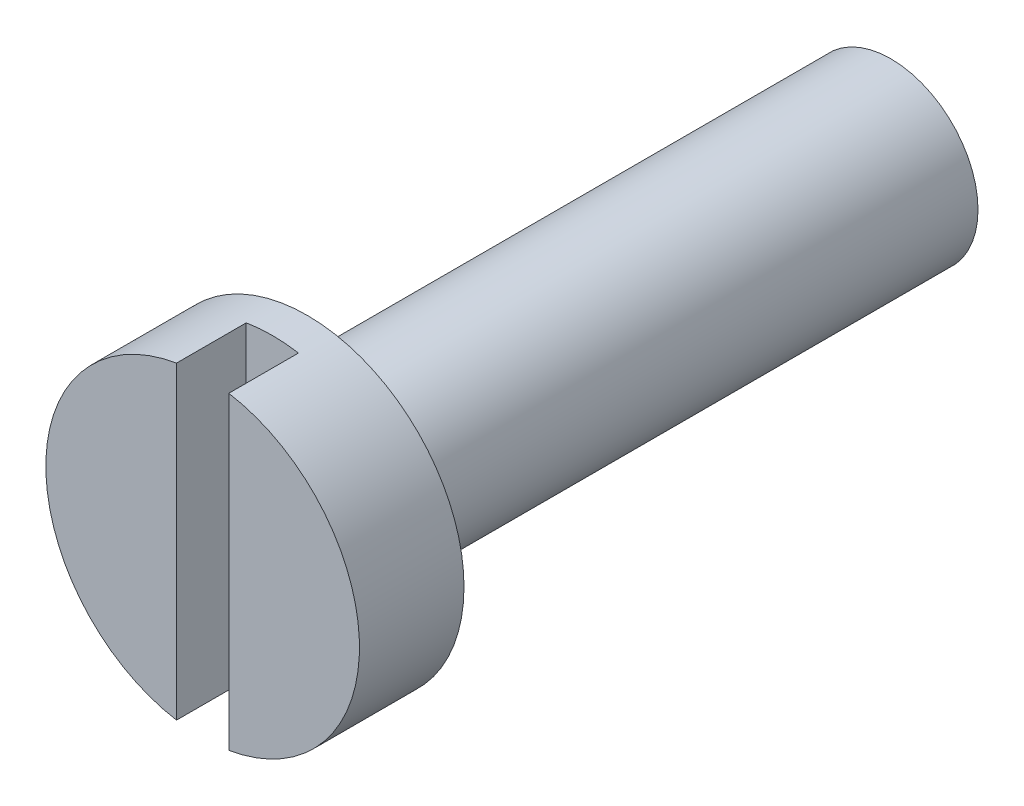
ISO-10303-21;
HEADER;
FILE_DESCRIPTION(('STEP AP214'),'2;1');
FILE_NAME('part.step','',(''),(''),'','','');
FILE_SCHEMA(('AUTOMOTIVE_DESIGN { 1 0 10303 214 1 1 1 1 }'));
ENDSEC;
DATA;
#1=APPLICATION_CONTEXT('core data for automotive mechanical design processes');
#2=APPLICATION_PROTOCOL_DEFINITION('international standard','automotive_design',2000,#1);
#3=PRODUCT_CONTEXT('',#1,'mechanical');
#4=PRODUCT('Part','Part','',(#3));
#5=PRODUCT_RELATED_PRODUCT_CATEGORY('part','',(#4));
#6=PRODUCT_DEFINITION_FORMATION('','',#4);
#7=PRODUCT_DEFINITION_CONTEXT('part definition',#1,'design');
#8=PRODUCT_DEFINITION('design','',#6,#7);
#9=PRODUCT_DEFINITION_SHAPE('','',#8);
#10=(LENGTH_UNIT() NAMED_UNIT(*) SI_UNIT(.MILLI.,.METRE.));
#11=(NAMED_UNIT(*) PLANE_ANGLE_UNIT() SI_UNIT($,.RADIAN.));
#12=(NAMED_UNIT(*) SI_UNIT($,.STERADIAN.) SOLID_ANGLE_UNIT());
#13=UNCERTAINTY_MEASURE_WITH_UNIT(LENGTH_MEASURE(1.E-05),#10,'distance_accuracy_value','');
#14=(GEOMETRIC_REPRESENTATION_CONTEXT(3) GLOBAL_UNCERTAINTY_ASSIGNED_CONTEXT((#13)) GLOBAL_UNIT_ASSIGNED_CONTEXT((#10,
#11,#12)) REPRESENTATION_CONTEXT('',''));
#15=CARTESIAN_POINT('',(0.,0.,0.));
#16=DIRECTION('',(0.,0.,1.));
#17=DIRECTION('',(1.,0.,0.));
#18=AXIS2_PLACEMENT_3D('',#15,#16,#17);
#19=CARTESIAN_POINT('',(0.,0.,19.75));
#20=DIRECTION('',(0.,0.,1.));
#21=DIRECTION('',(1.,0.,0.));
#22=AXIS2_PLACEMENT_3D('',#19,#20,#21);
#23=PLANE('',#22);
#24=DIRECTION('',(0.,1.,0.));
#25=VECTOR('',#24,1.);
#26=CARTESIAN_POINT('',(0.75,0.,19.75));
#27=LINE('',#26,#25);
#28=CARTESIAN_POINT('',(0.750000000000001,-4.43705983732471,19.75));
#29=VERTEX_POINT('',#28);
#30=CARTESIAN_POINT('',(0.75,4.43705983732471,19.75));
#31=VERTEX_POINT('',#30);
#32=EDGE_CURVE('E122',#29,#31,#27,.T.);
#33=ORIENTED_EDGE('',*,*,#32,.F.);
#34=CARTESIAN_POINT('',(0.,0.,19.75));
#35=DIRECTION('',(0.,0.,1.));
#36=DIRECTION('',(1.,0.,0.));
#37=AXIS2_PLACEMENT_3D('',#34,#35,#36);
#38=CIRCLE('',#37,4.5);
#39=EDGE_CURVE('E109',#29,#31,#38,.T.);
#40=ORIENTED_EDGE('',*,*,#39,.T.);
#41=EDGE_LOOP('',(#33,#40));
#42=FACE_BOUND('',#41,.T.);
#43=ADVANCED_FACE('F37',(#42),#23,.T.);
#44=CARTESIAN_POINT('',(0.,0.,16.75));
#45=DIRECTION('',(0.,0.,-1.));
#46=DIRECTION('',(-1.,0.,0.));
#47=AXIS2_PLACEMENT_3D('',#44,#45,#46);
#48=CYLINDRICAL_SURFACE('',#47,2.5);
#49=CARTESIAN_POINT('',(0.,0.,16.75));
#50=DIRECTION('',(0.,0.,1.));
#51=DIRECTION('',(1.,0.,0.));
#52=AXIS2_PLACEMENT_3D('',#49,#50,#51);
#53=CIRCLE('',#52,2.5);
#54=CARTESIAN_POINT('',(2.5,0.,16.75));
#55=VERTEX_POINT('',#54);
#56=EDGE_CURVE('E115',#55,#55,#53,.T.);
#57=ORIENTED_EDGE('',*,*,#56,.F.);
#58=EDGE_LOOP('',(#57));
#59=FACE_BOUND('',#58,.T.);
#60=CARTESIAN_POINT('',(0.,0.,0.));
#61=DIRECTION('',(0.,0.,1.));
#62=DIRECTION('',(1.,0.,0.));
#63=AXIS2_PLACEMENT_3D('',#60,#61,#62);
#64=CIRCLE('',#63,2.5);
#65=CARTESIAN_POINT('',(2.5,0.,0.));
#66=VERTEX_POINT('',#65);
#67=EDGE_CURVE('E119',#66,#66,#64,.T.);
#68=ORIENTED_EDGE('',*,*,#67,.T.);
#69=EDGE_LOOP('',(#68));
#70=FACE_BOUND('',#69,.T.);
#71=ADVANCED_FACE('F39',(#59,#70),#48,.T.);
#72=CARTESIAN_POINT('',(0.,0.,0.));
#73=DIRECTION('',(0.,0.,1.));
#74=DIRECTION('',(1.,0.,0.));
#75=AXIS2_PLACEMENT_3D('',#72,#73,#74);
#76=PLANE('',#75);
#77=CARTESIAN_POINT('',(0.,0.,0.));
#78=DIRECTION('',(0.,0.,-1.));
#79=DIRECTION('',(-1.,0.,0.));
#80=AXIS2_PLACEMENT_3D('',#77,#78,#79);
#81=CIRCLE('',#80,1.25);
#82=CARTESIAN_POINT('',(-1.25,0.,0.));
#83=VERTEX_POINT('',#82);
#84=EDGE_CURVE('E91',#83,#83,#81,.T.);
#85=ORIENTED_EDGE('',*,*,#84,.F.);
#86=EDGE_LOOP('',(#85));
#87=FACE_BOUND('',#86,.T.);
#88=ORIENTED_EDGE('',*,*,#67,.F.);
#89=EDGE_LOOP('',(#88));
#90=FACE_BOUND('',#89,.T.);
#91=ADVANCED_FACE('F140',(#87,#90),#76,.F.);
#92=CARTESIAN_POINT('',(0.,0.,19.75));
#93=DIRECTION('',(0.,0.,-1.));
#94=DIRECTION('',(-1.,0.,0.));
#95=AXIS2_PLACEMENT_3D('',#92,#93,#94);
#96=CYLINDRICAL_SURFACE('',#95,4.5);
#97=CARTESIAN_POINT('',(0.,0.,17.75));
#98=DIRECTION('',(0.,0.,1.));
#99=DIRECTION('',(1.,0.,0.));
#100=AXIS2_PLACEMENT_3D('',#97,#98,#99);
#101=CIRCLE('',#100,4.5);
#102=CARTESIAN_POINT('',(0.75,4.43705983732471,17.75));
#103=VERTEX_POINT('',#102);
#104=CARTESIAN_POINT('',(-0.75,4.43705983732471,17.75));
#105=VERTEX_POINT('',#104);
#106=EDGE_CURVE('E11',#103,#105,#101,.T.);
#107=ORIENTED_EDGE('',*,*,#106,.F.);
#108=DIRECTION('',(0.,0.,-1.));
#109=VECTOR('',#108,1.);
#110=CARTESIAN_POINT('',(0.75,4.43705983732471,19.75));
#111=LINE('',#110,#109);
#112=EDGE_CURVE('E60',#103,#31,#111,.F.);
#113=ORIENTED_EDGE('',*,*,#112,.T.);
#114=ORIENTED_EDGE('',*,*,#39,.F.);
#115=DIRECTION('',(0.,0.,-1.));
#116=VECTOR('',#115,1.);
#117=CARTESIAN_POINT('',(0.750000000000001,-4.43705983732471,19.75));
#118=LINE('',#117,#116);
#119=CARTESIAN_POINT('',(0.750000000000001,-4.43705983732471,17.75));
#120=VERTEX_POINT('',#119);
#121=EDGE_CURVE('E105',#29,#120,#118,.T.);
#122=ORIENTED_EDGE('',*,*,#121,.T.);
#123=CARTESIAN_POINT('',(-0.749999999999999,-4.43705983732471,17.75));
#124=VERTEX_POINT('',#123);
#125=EDGE_CURVE('E41',#124,#120,#101,.T.);
#126=ORIENTED_EDGE('',*,*,#125,.F.);
#127=DIRECTION('',(0.,0.,-1.));
#128=VECTOR('',#127,1.);
#129=CARTESIAN_POINT('',(-0.749999999999999,-4.43705983732471,19.75));
#130=LINE('',#129,#128);
#131=CARTESIAN_POINT('',(-0.749999999999999,-4.43705983732471,19.75));
#132=VERTEX_POINT('',#131);
#133=EDGE_CURVE('E100',#124,#132,#130,.F.);
#134=ORIENTED_EDGE('',*,*,#133,.T.);
#135=CARTESIAN_POINT('',(-0.75,4.43705983732471,19.75));
#136=VERTEX_POINT('',#135);
#137=EDGE_CURVE('E112',#136,#132,#38,.T.);
#138=ORIENTED_EDGE('',*,*,#137,.F.);
#139=DIRECTION('',(0.,0.,-1.));
#140=VECTOR('',#139,1.);
#141=CARTESIAN_POINT('',(-0.75,4.43705983732471,19.75));
#142=LINE('',#141,#140);
#143=EDGE_CURVE('E52',#136,#105,#142,.T.);
#144=ORIENTED_EDGE('',*,*,#143,.T.);
#145=EDGE_LOOP('',(#107,#113,#114,#122,#126,#134,#138,#144));
#146=FACE_BOUND('',#145,.T.);
#147=CARTESIAN_POINT('',(0.,0.,16.75));
#148=DIRECTION('',(0.,0.,1.));
#149=DIRECTION('',(1.,0.,0.));
#150=AXIS2_PLACEMENT_3D('',#147,#148,#149);
#151=CIRCLE('',#150,4.5);
#152=CARTESIAN_POINT('',(4.5,0.,16.75));
#153=VERTEX_POINT('',#152);
#154=EDGE_CURVE('E108',#153,#153,#151,.T.);
#155=ORIENTED_EDGE('',*,*,#154,.T.);
#156=EDGE_LOOP('',(#155));
#157=FACE_BOUND('',#156,.T.);
#158=ADVANCED_FACE('F131',(#146,#157),#96,.T.);
#159=DIRECTION('',(0.,-1.,0.));
#160=VECTOR('',#159,1.);
#161=CARTESIAN_POINT('',(-0.75,0.,19.75));
#162=LINE('',#161,#160);
#163=EDGE_CURVE('E118',#136,#132,#162,.T.);
#164=ORIENTED_EDGE('',*,*,#163,.F.);
#165=ORIENTED_EDGE('',*,*,#137,.T.);
#166=EDGE_LOOP('',(#164,#165));
#167=FACE_BOUND('',#166,.T.);
#168=ADVANCED_FACE('F136',(#167),#23,.T.);
#169=CARTESIAN_POINT('',(0.,0.,16.75));
#170=DIRECTION('',(0.,0.,1.));
#171=DIRECTION('',(1.,0.,0.));
#172=AXIS2_PLACEMENT_3D('',#169,#170,#171);
#173=PLANE('',#172);
#174=ORIENTED_EDGE('',*,*,#56,.T.);
#175=EDGE_LOOP('',(#174));
#176=FACE_BOUND('',#175,.T.);
#177=ORIENTED_EDGE('',*,*,#154,.F.);
#178=EDGE_LOOP('',(#177));
#179=FACE_BOUND('',#178,.T.);
#180=ADVANCED_FACE('F145',(#176,#179),#173,.F.);
#181=CARTESIAN_POINT('',(0.,0.,17.75));
#182=DIRECTION('',(0.,0.,1.));
#183=DIRECTION('',(1.,0.,0.));
#184=AXIS2_PLACEMENT_3D('',#181,#182,#183);
#185=PLANE('',#184);
#186=ORIENTED_EDGE('',*,*,#106,.T.);
#187=DIRECTION('',(0.,-1.,0.));
#188=VECTOR('',#187,1.);
#189=CARTESIAN_POINT('',(-0.75,5.46844597131234,17.75));
#190=LINE('',#189,#188);
#191=EDGE_CURVE('E93',#105,#124,#190,.T.);
#192=ORIENTED_EDGE('',*,*,#191,.T.);
#193=ORIENTED_EDGE('',*,*,#125,.T.);
#194=DIRECTION('',(0.,1.,0.));
#195=VECTOR('',#194,1.);
#196=CARTESIAN_POINT('',(0.75,5.46844597131234,17.75));
#197=LINE('',#196,#195);
#198=EDGE_CURVE('E90',#120,#103,#197,.T.);
#199=ORIENTED_EDGE('',*,*,#198,.T.);
#200=EDGE_LOOP('',(#186,#192,#193,#199));
#201=FACE_BOUND('',#200,.T.);
#202=ADVANCED_FACE('F126',(#201),#185,.T.);
#203=CARTESIAN_POINT('',(0.75,5.46844597131234,17.75));
#204=DIRECTION('',(1.,0.,0.));
#205=DIRECTION('',(0.,1.,0.));
#206=AXIS2_PLACEMENT_3D('',#203,#204,#205);
#207=PLANE('',#206);
#208=ORIENTED_EDGE('',*,*,#32,.T.);
#209=ORIENTED_EDGE('',*,*,#112,.F.);
#210=ORIENTED_EDGE('',*,*,#198,.F.);
#211=ORIENTED_EDGE('',*,*,#121,.F.);
#212=EDGE_LOOP('',(#208,#209,#210,#211));
#213=FACE_BOUND('',#212,.T.);
#214=ADVANCED_FACE('F129',(#213),#207,.F.);
#215=CARTESIAN_POINT('',(-0.75,5.46844597131234,17.75));
#216=DIRECTION('',(-1.,0.,0.));
#217=DIRECTION('',(0.,-1.,0.));
#218=AXIS2_PLACEMENT_3D('',#215,#216,#217);
#219=PLANE('',#218);
#220=ORIENTED_EDGE('',*,*,#163,.T.);
#221=ORIENTED_EDGE('',*,*,#133,.F.);
#222=ORIENTED_EDGE('',*,*,#191,.F.);
#223=ORIENTED_EDGE('',*,*,#143,.F.);
#224=EDGE_LOOP('',(#220,#221,#222,#223));
#225=FACE_BOUND('',#224,.T.);
#226=ADVANCED_FACE('F84',(#225),#219,.F.);
#227=CARTESIAN_POINT('',(0.,0.,10.));
#228=DIRECTION('',(0.,0.,-1.));
#229=DIRECTION('',(-1.,0.,0.));
#230=AXIS2_PLACEMENT_3D('',#227,#228,#229);
#231=CONICAL_SURFACE('',#230,1.25,1.02974425867665);
#232=CARTESIAN_POINT('',(0.,0.,10.7510757737845));
#233=VERTEX_POINT('',#232);
#234=VERTEX_LOOP('',#233);
#235=FACE_BOUND('',#234,.T.);
#236=CARTESIAN_POINT('',(0.,0.,10.));
#237=DIRECTION('',(0.,0.,-1.));
#238=DIRECTION('',(-1.,0.,0.));
#239=AXIS2_PLACEMENT_3D('',#236,#237,#238);
#240=CIRCLE('',#239,1.25);
#241=CARTESIAN_POINT('',(-1.25,0.,10.));
#242=VERTEX_POINT('',#241);
#243=EDGE_CURVE('E88',#242,#242,#240,.T.);
#244=ORIENTED_EDGE('',*,*,#243,.T.);
#245=EDGE_LOOP('',(#244));
#246=FACE_BOUND('',#245,.T.);
#247=ADVANCED_FACE('F80',(#235,#246),#231,.F.);
#248=CARTESIAN_POINT('',(0.,0.,0.));
#249=DIRECTION('',(0.,0.,-1.));
#250=DIRECTION('',(-1.,0.,0.));
#251=AXIS2_PLACEMENT_3D('',#248,#249,#250);
#252=CYLINDRICAL_SURFACE('',#251,1.25);
#253=ORIENTED_EDGE('',*,*,#243,.F.);
#254=EDGE_LOOP('',(#253));
#255=FACE_BOUND('',#254,.T.);
#256=ORIENTED_EDGE('',*,*,#84,.T.);
#257=EDGE_LOOP('',(#256));
#258=FACE_BOUND('',#257,.T.);
#259=ADVANCED_FACE('F83',(#255,#258),#252,.F.);
#260=CLOSED_SHELL('',(#43,#71,#91,#158,#168,#180,#202,#214,#226,#247,#259));
#261=MANIFOLD_SOLID_BREP('B2',#260);
#262=ADVANCED_BREP_SHAPE_REPRESENTATION('',(#18,#261),#14);
#263=SHAPE_DEFINITION_REPRESENTATION(#9,#262);
ENDSEC;
END-ISO-10303-21;
